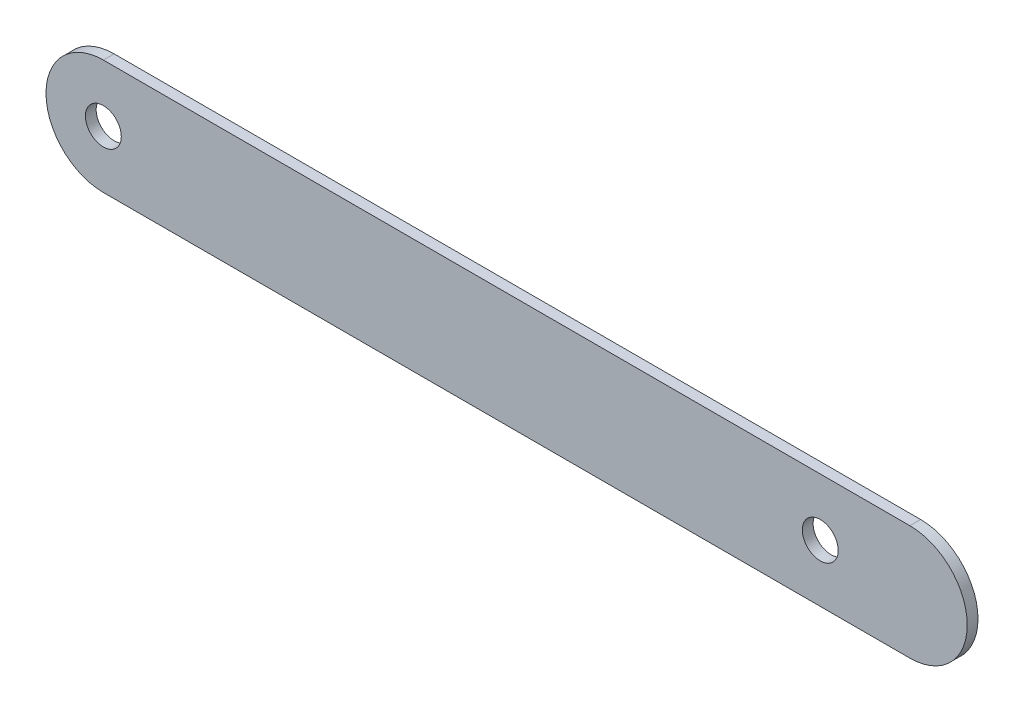
ISO-10303-21;
HEADER;
FILE_DESCRIPTION(('STEP AP214'),'2;1');
FILE_NAME('part.step','',(''),(''),'','','');
FILE_SCHEMA(('AUTOMOTIVE_DESIGN { 1 0 10303 214 1 1 1 1 }'));
ENDSEC;
DATA;
#1=APPLICATION_CONTEXT('core data for automotive mechanical design processes');
#2=APPLICATION_PROTOCOL_DEFINITION('international standard','automotive_design',2000,#1);
#3=PRODUCT_CONTEXT('',#1,'mechanical');
#4=PRODUCT('Part','Part','',(#3));
#5=PRODUCT_RELATED_PRODUCT_CATEGORY('part','',(#4));
#6=PRODUCT_DEFINITION_FORMATION('','',#4);
#7=PRODUCT_DEFINITION_CONTEXT('part definition',#1,'design');
#8=PRODUCT_DEFINITION('design','',#6,#7);
#9=PRODUCT_DEFINITION_SHAPE('','',#8);
#10=(LENGTH_UNIT() NAMED_UNIT(*) SI_UNIT(.MILLI.,.METRE.));
#11=(NAMED_UNIT(*) PLANE_ANGLE_UNIT() SI_UNIT($,.RADIAN.));
#12=(NAMED_UNIT(*) SI_UNIT($,.STERADIAN.) SOLID_ANGLE_UNIT());
#13=UNCERTAINTY_MEASURE_WITH_UNIT(LENGTH_MEASURE(1.E-05),#10,'distance_accuracy_value','');
#14=(GEOMETRIC_REPRESENTATION_CONTEXT(3) GLOBAL_UNCERTAINTY_ASSIGNED_CONTEXT((#13)) GLOBAL_UNIT_ASSIGNED_CONTEXT((#10,
#11,#12)) REPRESENTATION_CONTEXT('',''));
#15=CARTESIAN_POINT('',(0.,0.,0.));
#16=DIRECTION('',(0.,0.,1.));
#17=DIRECTION('',(1.,0.,0.));
#18=AXIS2_PLACEMENT_3D('',#15,#16,#17);
#19=CARTESIAN_POINT('',(0.,0.,3.));
#20=DIRECTION('',(0.,0.,1.));
#21=DIRECTION('',(1.,0.,0.));
#22=AXIS2_PLACEMENT_3D('',#19,#20,#21);
#23=PLANE('',#22);
#24=CARTESIAN_POINT('',(0.,0.,3.));
#25=DIRECTION('',(0.,0.,1.));
#26=DIRECTION('',(1.,0.,0.));
#27=AXIS2_PLACEMENT_3D('',#24,#25,#26);
#28=CIRCLE('',#27,5.);
#29=CARTESIAN_POINT('',(5.,0.,3.));
#30=VERTEX_POINT('',#29);
#31=EDGE_CURVE('E100',#30,#30,#28,.T.);
#32=ORIENTED_EDGE('',*,*,#31,.F.);
#33=EDGE_LOOP('',(#32));
#34=FACE_BOUND('',#33,.T.);
#35=CARTESIAN_POINT('',(0.,0.,3.));
#36=DIRECTION('',(0.,0.,1.));
#37=DIRECTION('',(1.,0.,0.));
#38=AXIS2_PLACEMENT_3D('',#35,#36,#37);
#39=CIRCLE('',#38,16.);
#40=CARTESIAN_POINT('',(0.,16.,3.));
#41=VERTEX_POINT('',#40);
#42=CARTESIAN_POINT('',(0.,-16.,3.));
#43=VERTEX_POINT('',#42);
#44=EDGE_CURVE('E85',#41,#43,#39,.T.);
#45=ORIENTED_EDGE('',*,*,#44,.T.);
#46=DIRECTION('',(1.,0.,0.));
#47=VECTOR('',#46,1.);
#48=CARTESIAN_POINT('',(0.,-16.,3.));
#49=LINE('',#48,#47);
#50=CARTESIAN_POINT('',(225.,-16.,3.));
#51=VERTEX_POINT('',#50);
#52=EDGE_CURVE('E80',#43,#51,#49,.T.);
#53=ORIENTED_EDGE('',*,*,#52,.T.);
#54=CARTESIAN_POINT('',(225.,0.,3.));
#55=DIRECTION('',(0.,0.,1.));
#56=DIRECTION('',(1.,0.,0.));
#57=AXIS2_PLACEMENT_3D('',#54,#55,#56);
#58=CIRCLE('',#57,16.);
#59=CARTESIAN_POINT('',(225.,16.,3.));
#60=VERTEX_POINT('',#59);
#61=EDGE_CURVE('E83',#51,#60,#58,.T.);
#62=ORIENTED_EDGE('',*,*,#61,.T.);
#63=DIRECTION('',(-1.,0.,0.));
#64=VECTOR('',#63,1.);
#65=CARTESIAN_POINT('',(0.,16.,3.));
#66=LINE('',#65,#64);
#67=EDGE_CURVE('E50',#60,#41,#66,.T.);
#68=ORIENTED_EDGE('',*,*,#67,.T.);
#69=EDGE_LOOP('',(#45,#53,#62,#68));
#70=FACE_BOUND('',#69,.T.);
#71=CARTESIAN_POINT('',(200.,0.,3.));
#72=DIRECTION('',(0.,0.,1.));
#73=DIRECTION('',(1.,0.,0.));
#74=AXIS2_PLACEMENT_3D('',#71,#72,#73);
#75=CIRCLE('',#74,4.99999999999999);
#76=CARTESIAN_POINT('',(205.,0.,3.));
#77=VERTEX_POINT('',#76);
#78=EDGE_CURVE('E115',#77,#77,#75,.T.);
#79=ORIENTED_EDGE('',*,*,#78,.F.);
#80=EDGE_LOOP('',(#79));
#81=FACE_BOUND('',#80,.T.);
#82=ADVANCED_FACE('F33',(#34,#70,#81),#23,.T.);
#83=CARTESIAN_POINT('',(0.,0.,0.));
#84=DIRECTION('',(0.,0.,1.));
#85=DIRECTION('',(1.,0.,0.));
#86=AXIS2_PLACEMENT_3D('',#83,#84,#85);
#87=PLANE('',#86);
#88=CARTESIAN_POINT('',(0.,0.,0.));
#89=DIRECTION('',(0.,0.,1.));
#90=DIRECTION('',(1.,0.,0.));
#91=AXIS2_PLACEMENT_3D('',#88,#89,#90);
#92=CIRCLE('',#91,16.);
#93=CARTESIAN_POINT('',(0.,16.,0.));
#94=VERTEX_POINT('',#93);
#95=CARTESIAN_POINT('',(0.,-16.,0.));
#96=VERTEX_POINT('',#95);
#97=EDGE_CURVE('E97',#94,#96,#92,.T.);
#98=ORIENTED_EDGE('',*,*,#97,.F.);
#99=DIRECTION('',(-1.,0.,0.));
#100=VECTOR('',#99,1.);
#101=CARTESIAN_POINT('',(0.,16.,0.));
#102=LINE('',#101,#100);
#103=CARTESIAN_POINT('',(225.,16.,0.));
#104=VERTEX_POINT('',#103);
#105=EDGE_CURVE('E73',#104,#94,#102,.T.);
#106=ORIENTED_EDGE('',*,*,#105,.F.);
#107=CARTESIAN_POINT('',(225.,0.,0.));
#108=DIRECTION('',(0.,0.,1.));
#109=DIRECTION('',(1.,0.,0.));
#110=AXIS2_PLACEMENT_3D('',#107,#108,#109);
#111=CIRCLE('',#110,16.);
#112=CARTESIAN_POINT('',(225.,-16.,0.));
#113=VERTEX_POINT('',#112);
#114=EDGE_CURVE('E67',#113,#104,#111,.T.);
#115=ORIENTED_EDGE('',*,*,#114,.F.);
#116=DIRECTION('',(1.,0.,0.));
#117=VECTOR('',#116,1.);
#118=CARTESIAN_POINT('',(0.,-16.,0.));
#119=LINE('',#118,#117);
#120=EDGE_CURVE('E89',#96,#113,#119,.T.);
#121=ORIENTED_EDGE('',*,*,#120,.F.);
#122=EDGE_LOOP('',(#98,#106,#115,#121));
#123=FACE_BOUND('',#122,.T.);
#124=CARTESIAN_POINT('',(0.,0.,0.));
#125=DIRECTION('',(0.,0.,1.));
#126=DIRECTION('',(1.,0.,0.));
#127=AXIS2_PLACEMENT_3D('',#124,#125,#126);
#128=CIRCLE('',#127,5.);
#129=CARTESIAN_POINT('',(5.,0.,0.));
#130=VERTEX_POINT('',#129);
#131=EDGE_CURVE('E112',#130,#130,#128,.T.);
#132=ORIENTED_EDGE('',*,*,#131,.T.);
#133=EDGE_LOOP('',(#132));
#134=FACE_BOUND('',#133,.T.);
#135=CARTESIAN_POINT('',(200.,0.,0.));
#136=DIRECTION('',(0.,0.,1.));
#137=DIRECTION('',(1.,0.,0.));
#138=AXIS2_PLACEMENT_3D('',#135,#136,#137);
#139=CIRCLE('',#138,4.99999999999999);
#140=CARTESIAN_POINT('',(205.,0.,0.));
#141=VERTEX_POINT('',#140);
#142=EDGE_CURVE('E118',#141,#141,#139,.T.);
#143=ORIENTED_EDGE('',*,*,#142,.T.);
#144=EDGE_LOOP('',(#143));
#145=FACE_BOUND('',#144,.T.);
#146=ADVANCED_FACE('F108',(#123,#134,#145),#87,.F.);
#147=CARTESIAN_POINT('',(0.,0.,3.));
#148=DIRECTION('',(0.,0.,-1.));
#149=DIRECTION('',(-1.,0.,0.));
#150=AXIS2_PLACEMENT_3D('',#147,#148,#149);
#151=CYLINDRICAL_SURFACE('',#150,16.);
#152=ORIENTED_EDGE('',*,*,#97,.T.);
#153=DIRECTION('',(0.,0.,-1.));
#154=VECTOR('',#153,1.);
#155=CARTESIAN_POINT('',(0.,-16.,3.));
#156=LINE('',#155,#154);
#157=EDGE_CURVE('E11',#43,#96,#156,.T.);
#158=ORIENTED_EDGE('',*,*,#157,.F.);
#159=ORIENTED_EDGE('',*,*,#44,.F.);
#160=DIRECTION('',(0.,0.,-1.));
#161=VECTOR('',#160,1.);
#162=CARTESIAN_POINT('',(0.,16.,3.));
#163=LINE('',#162,#161);
#164=EDGE_CURVE('E93',#41,#94,#163,.T.);
#165=ORIENTED_EDGE('',*,*,#164,.T.);
#166=EDGE_LOOP('',(#152,#158,#159,#165));
#167=FACE_BOUND('',#166,.T.);
#168=ADVANCED_FACE('F35',(#167),#151,.T.);
#169=CARTESIAN_POINT('',(0.,-16.,3.));
#170=DIRECTION('',(0.,1.,0.));
#171=DIRECTION('',(0.,0.,1.));
#172=AXIS2_PLACEMENT_3D('',#169,#170,#171);
#173=PLANE('',#172);
#174=ORIENTED_EDGE('',*,*,#120,.T.);
#175=DIRECTION('',(0.,0.,-1.));
#176=VECTOR('',#175,1.);
#177=CARTESIAN_POINT('',(225.,-16.,3.));
#178=LINE('',#177,#176);
#179=EDGE_CURVE('E42',#51,#113,#178,.T.);
#180=ORIENTED_EDGE('',*,*,#179,.F.);
#181=ORIENTED_EDGE('',*,*,#52,.F.);
#182=ORIENTED_EDGE('',*,*,#157,.T.);
#183=EDGE_LOOP('',(#174,#180,#181,#182));
#184=FACE_BOUND('',#183,.T.);
#185=ADVANCED_FACE('F88',(#184),#173,.F.);
#186=CARTESIAN_POINT('',(225.,0.,3.));
#187=DIRECTION('',(0.,0.,-1.));
#188=DIRECTION('',(-1.,0.,0.));
#189=AXIS2_PLACEMENT_3D('',#186,#187,#188);
#190=CYLINDRICAL_SURFACE('',#189,16.);
#191=ORIENTED_EDGE('',*,*,#114,.T.);
#192=DIRECTION('',(0.,0.,-1.));
#193=VECTOR('',#192,1.);
#194=CARTESIAN_POINT('',(225.,16.,3.));
#195=LINE('',#194,#193);
#196=EDGE_CURVE('E90',#60,#104,#195,.T.);
#197=ORIENTED_EDGE('',*,*,#196,.F.);
#198=ORIENTED_EDGE('',*,*,#61,.F.);
#199=ORIENTED_EDGE('',*,*,#179,.T.);
#200=EDGE_LOOP('',(#191,#197,#198,#199));
#201=FACE_BOUND('',#200,.T.);
#202=ADVANCED_FACE('F91',(#201),#190,.T.);
#203=CARTESIAN_POINT('',(0.,16.,3.));
#204=DIRECTION('',(0.,-1.,0.));
#205=DIRECTION('',(0.,0.,-1.));
#206=AXIS2_PLACEMENT_3D('',#203,#204,#205);
#207=PLANE('',#206);
#208=ORIENTED_EDGE('',*,*,#105,.T.);
#209=ORIENTED_EDGE('',*,*,#164,.F.);
#210=ORIENTED_EDGE('',*,*,#67,.F.);
#211=ORIENTED_EDGE('',*,*,#196,.T.);
#212=EDGE_LOOP('',(#208,#209,#210,#211));
#213=FACE_BOUND('',#212,.T.);
#214=ADVANCED_FACE('F105',(#213),#207,.F.);
#215=CARTESIAN_POINT('',(0.,0.,3.));
#216=DIRECTION('',(0.,0.,-1.));
#217=DIRECTION('',(-1.,0.,0.));
#218=AXIS2_PLACEMENT_3D('',#215,#216,#217);
#219=CYLINDRICAL_SURFACE('',#218,5.);
#220=ORIENTED_EDGE('',*,*,#31,.T.);
#221=EDGE_LOOP('',(#220));
#222=FACE_BOUND('',#221,.T.);
#223=ORIENTED_EDGE('',*,*,#131,.F.);
#224=EDGE_LOOP('',(#223));
#225=FACE_BOUND('',#224,.T.);
#226=ADVANCED_FACE('F135',(#222,#225),#219,.F.);
#227=CARTESIAN_POINT('',(200.,0.,3.));
#228=DIRECTION('',(0.,0.,-1.));
#229=DIRECTION('',(-1.,0.,0.));
#230=AXIS2_PLACEMENT_3D('',#227,#228,#229);
#231=CYLINDRICAL_SURFACE('',#230,4.99999999999999);
#232=ORIENTED_EDGE('',*,*,#78,.T.);
#233=EDGE_LOOP('',(#232));
#234=FACE_BOUND('',#233,.T.);
#235=ORIENTED_EDGE('',*,*,#142,.F.);
#236=EDGE_LOOP('',(#235));
#237=FACE_BOUND('',#236,.T.);
#238=ADVANCED_FACE('F124',(#234,#237),#231,.F.);
#239=CLOSED_SHELL('',(#82,#146,#168,#185,#202,#214,#226,#238));
#240=MANIFOLD_SOLID_BREP('B2',#239);
#241=ADVANCED_BREP_SHAPE_REPRESENTATION('',(#18,#240),#14);
#242=SHAPE_DEFINITION_REPRESENTATION(#9,#241);
ENDSEC;
END-ISO-10303-21;
